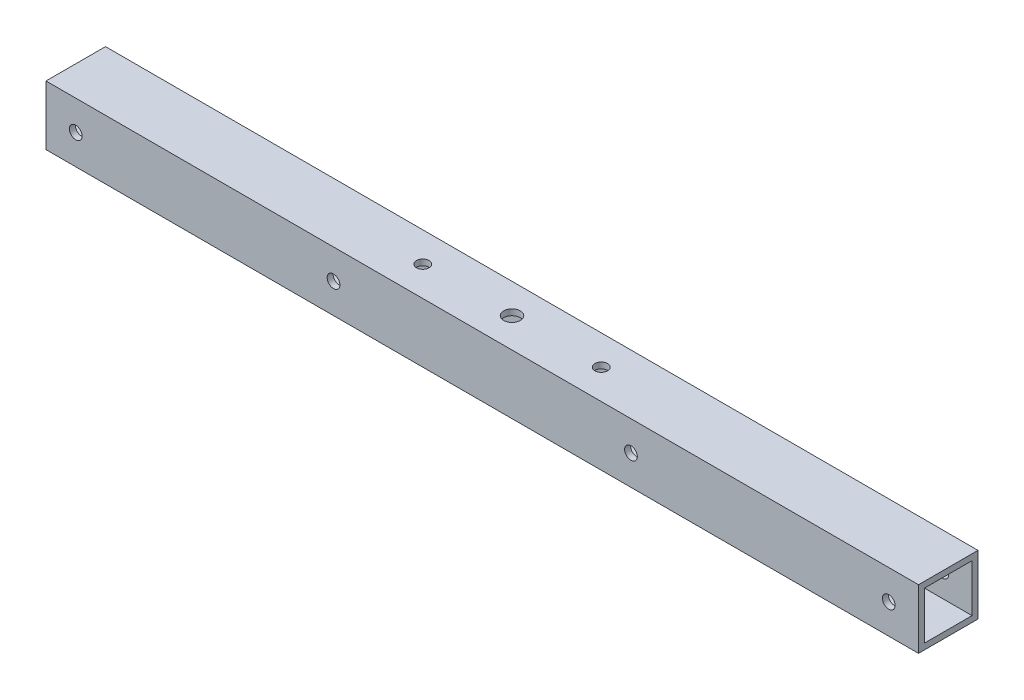
ISO-10303-21;
HEADER;
FILE_DESCRIPTION(('STEP AP214'),'2;1');
FILE_NAME('part.step','',(''),(''),'','','');
FILE_SCHEMA(('AUTOMOTIVE_DESIGN { 1 0 10303 214 1 1 1 1 }'));
ENDSEC;
DATA;
#1=APPLICATION_CONTEXT('core data for automotive mechanical design processes');
#2=APPLICATION_PROTOCOL_DEFINITION('international standard','automotive_design',2000,#1);
#3=PRODUCT_CONTEXT('',#1,'mechanical');
#4=PRODUCT('Part','Part','',(#3));
#5=PRODUCT_RELATED_PRODUCT_CATEGORY('part','',(#4));
#6=PRODUCT_DEFINITION_FORMATION('','',#4);
#7=PRODUCT_DEFINITION_CONTEXT('part definition',#1,'design');
#8=PRODUCT_DEFINITION('design','',#6,#7);
#9=PRODUCT_DEFINITION_SHAPE('','',#8);
#10=(LENGTH_UNIT() NAMED_UNIT(*) SI_UNIT(.MILLI.,.METRE.));
#11=(NAMED_UNIT(*) PLANE_ANGLE_UNIT() SI_UNIT($,.RADIAN.));
#12=(NAMED_UNIT(*) SI_UNIT($,.STERADIAN.) SOLID_ANGLE_UNIT());
#13=UNCERTAINTY_MEASURE_WITH_UNIT(LENGTH_MEASURE(1.E-05),#10,'distance_accuracy_value','');
#14=(GEOMETRIC_REPRESENTATION_CONTEXT(3) GLOBAL_UNCERTAINTY_ASSIGNED_CONTEXT((#13)) GLOBAL_UNIT_ASSIGNED_CONTEXT((#10,
#11,#12)) REPRESENTATION_CONTEXT('',''));
#15=CARTESIAN_POINT('',(0.,0.,0.));
#16=DIRECTION('',(0.,0.,1.));
#17=DIRECTION('',(1.,0.,0.));
#18=AXIS2_PLACEMENT_3D('',#15,#16,#17);
#19=CARTESIAN_POINT('',(220.,0.,0.));
#20=DIRECTION('',(1.,0.,0.));
#21=DIRECTION('',(0.,0.,-1.));
#22=AXIS2_PLACEMENT_3D('',#19,#20,#21);
#23=PLANE('',#22);
#24=DIRECTION('',(0.,1.,0.));
#25=VECTOR('',#24,1.);
#26=CARTESIAN_POINT('',(220.,7.5,-7.5));
#27=LINE('',#26,#25);
#28=CARTESIAN_POINT('',(220.,-7.5,-7.5));
#29=VERTEX_POINT('',#28);
#30=CARTESIAN_POINT('',(220.,7.5,-7.5));
#31=VERTEX_POINT('',#30);
#32=EDGE_CURVE('E153',#29,#31,#27,.T.);
#33=ORIENTED_EDGE('',*,*,#32,.T.);
#34=DIRECTION('',(0.,0.,1.));
#35=VECTOR('',#34,1.);
#36=CARTESIAN_POINT('',(220.,7.5,7.5));
#37=LINE('',#36,#35);
#38=CARTESIAN_POINT('',(220.,7.5,7.5));
#39=VERTEX_POINT('',#38);
#40=EDGE_CURVE('E156',#31,#39,#37,.T.);
#41=ORIENTED_EDGE('',*,*,#40,.T.);
#42=DIRECTION('',(0.,-1.,0.));
#43=VECTOR('',#42,1.);
#44=CARTESIAN_POINT('',(220.,7.5,7.5));
#45=LINE('',#44,#43);
#46=CARTESIAN_POINT('',(220.,-7.5,7.5));
#47=VERTEX_POINT('',#46);
#48=EDGE_CURVE('E159',#39,#47,#45,.T.);
#49=ORIENTED_EDGE('',*,*,#48,.T.);
#50=DIRECTION('',(0.,0.,-1.));
#51=VECTOR('',#50,1.);
#52=CARTESIAN_POINT('',(220.,-7.5,7.5));
#53=LINE('',#52,#51);
#54=EDGE_CURVE('E161',#47,#29,#53,.T.);
#55=ORIENTED_EDGE('',*,*,#54,.T.);
#56=EDGE_LOOP('',(#33,#41,#49,#55));
#57=FACE_BOUND('',#56,.T.);
#58=DIRECTION('',(0.,-1.,0.));
#59=VECTOR('',#58,1.);
#60=CARTESIAN_POINT('',(220.,6.,6.));
#61=LINE('',#60,#59);
#62=CARTESIAN_POINT('',(220.,6.,6.));
#63=VERTEX_POINT('',#62);
#64=CARTESIAN_POINT('',(220.,-6.,6.));
#65=VERTEX_POINT('',#64);
#66=EDGE_CURVE('E123',#63,#65,#61,.T.);
#67=ORIENTED_EDGE('',*,*,#66,.F.);
#68=DIRECTION('',(0.,0.,1.));
#69=VECTOR('',#68,1.);
#70=CARTESIAN_POINT('',(220.,6.,6.));
#71=LINE('',#70,#69);
#72=CARTESIAN_POINT('',(220.,6.,-6.));
#73=VERTEX_POINT('',#72);
#74=EDGE_CURVE('E115',#73,#63,#71,.T.);
#75=ORIENTED_EDGE('',*,*,#74,.F.);
#76=DIRECTION('',(0.,1.,0.));
#77=VECTOR('',#76,1.);
#78=CARTESIAN_POINT('',(220.,6.,-6.));
#79=LINE('',#78,#77);
#80=CARTESIAN_POINT('',(220.,-6.,-6.));
#81=VERTEX_POINT('',#80);
#82=EDGE_CURVE('E137',#81,#73,#79,.T.);
#83=ORIENTED_EDGE('',*,*,#82,.F.);
#84=DIRECTION('',(0.,0.,-1.));
#85=VECTOR('',#84,1.);
#86=CARTESIAN_POINT('',(220.,-6.,6.));
#87=LINE('',#86,#85);
#88=EDGE_CURVE('E135',#65,#81,#87,.T.);
#89=ORIENTED_EDGE('',*,*,#88,.F.);
#90=EDGE_LOOP('',(#67,#75,#83,#89));
#91=FACE_BOUND('',#90,.T.);
#92=ADVANCED_FACE('F48',(#57,#91),#23,.T.);
#93=CARTESIAN_POINT('',(0.,0.,0.));
#94=DIRECTION('',(1.,0.,0.));
#95=DIRECTION('',(0.,0.,-1.));
#96=AXIS2_PLACEMENT_3D('',#93,#94,#95);
#97=PLANE('',#96);
#98=DIRECTION('',(0.,1.,0.));
#99=VECTOR('',#98,1.);
#100=CARTESIAN_POINT('',(0.,7.5,-7.5));
#101=LINE('',#100,#99);
#102=CARTESIAN_POINT('',(0.,-7.5,-7.5));
#103=VERTEX_POINT('',#102);
#104=CARTESIAN_POINT('',(0.,7.5,-7.5));
#105=VERTEX_POINT('',#104);
#106=EDGE_CURVE('E131',#103,#105,#101,.T.);
#107=ORIENTED_EDGE('',*,*,#106,.F.);
#108=DIRECTION('',(0.,0.,-1.));
#109=VECTOR('',#108,1.);
#110=CARTESIAN_POINT('',(0.,-7.5,7.5));
#111=LINE('',#110,#109);
#112=CARTESIAN_POINT('',(0.,-7.5,7.5));
#113=VERTEX_POINT('',#112);
#114=EDGE_CURVE('E157',#113,#103,#111,.T.);
#115=ORIENTED_EDGE('',*,*,#114,.F.);
#116=DIRECTION('',(0.,-1.,0.));
#117=VECTOR('',#116,1.);
#118=CARTESIAN_POINT('',(0.,7.5,7.5));
#119=LINE('',#118,#117);
#120=CARTESIAN_POINT('',(0.,7.5,7.5));
#121=VERTEX_POINT('',#120);
#122=EDGE_CURVE('E168',#121,#113,#119,.T.);
#123=ORIENTED_EDGE('',*,*,#122,.F.);
#124=DIRECTION('',(0.,0.,1.));
#125=VECTOR('',#124,1.);
#126=CARTESIAN_POINT('',(0.,7.5,7.5));
#127=LINE('',#126,#125);
#128=EDGE_CURVE('E166',#105,#121,#127,.T.);
#129=ORIENTED_EDGE('',*,*,#128,.F.);
#130=EDGE_LOOP('',(#107,#115,#123,#129));
#131=FACE_BOUND('',#130,.T.);
#132=DIRECTION('',(0.,0.,1.));
#133=VECTOR('',#132,1.);
#134=CARTESIAN_POINT('',(0.,6.,6.));
#135=LINE('',#134,#133);
#136=CARTESIAN_POINT('',(0.,6.,-6.));
#137=VERTEX_POINT('',#136);
#138=CARTESIAN_POINT('',(0.,6.,6.));
#139=VERTEX_POINT('',#138);
#140=EDGE_CURVE('E73',#137,#139,#135,.T.);
#141=ORIENTED_EDGE('',*,*,#140,.T.);
#142=DIRECTION('',(0.,-1.,0.));
#143=VECTOR('',#142,1.);
#144=CARTESIAN_POINT('',(0.,6.,6.));
#145=LINE('',#144,#143);
#146=CARTESIAN_POINT('',(0.,-6.,6.));
#147=VERTEX_POINT('',#146);
#148=EDGE_CURVE('E130',#139,#147,#145,.T.);
#149=ORIENTED_EDGE('',*,*,#148,.T.);
#150=DIRECTION('',(0.,0.,-1.));
#151=VECTOR('',#150,1.);
#152=CARTESIAN_POINT('',(0.,-6.,6.));
#153=LINE('',#152,#151);
#154=CARTESIAN_POINT('',(0.,-6.,-6.));
#155=VERTEX_POINT('',#154);
#156=EDGE_CURVE('E145',#147,#155,#153,.T.);
#157=ORIENTED_EDGE('',*,*,#156,.T.);
#158=DIRECTION('',(0.,1.,0.));
#159=VECTOR('',#158,1.);
#160=CARTESIAN_POINT('',(0.,6.,-6.));
#161=LINE('',#160,#159);
#162=EDGE_CURVE('E124',#155,#137,#161,.T.);
#163=ORIENTED_EDGE('',*,*,#162,.T.);
#164=EDGE_LOOP('',(#141,#149,#157,#163));
#165=FACE_BOUND('',#164,.T.);
#166=ADVANCED_FACE('F286',(#131,#165),#97,.F.);
#167=CARTESIAN_POINT('',(220.,7.5,-7.5));
#168=DIRECTION('',(0.,0.,1.));
#169=DIRECTION('',(1.,0.,0.));
#170=AXIS2_PLACEMENT_3D('',#167,#168,#169);
#171=PLANE('',#170);
#172=CARTESIAN_POINT('',(7.5,0.,-7.5));
#173=DIRECTION('',(0.,0.,1.));
#174=DIRECTION('',(1.,0.,0.));
#175=AXIS2_PLACEMENT_3D('',#172,#173,#174);
#176=CIRCLE('',#175,1.6);
#177=CARTESIAN_POINT('',(9.1,0.,-7.5));
#178=VERTEX_POINT('',#177);
#179=EDGE_CURVE('E182',#178,#178,#176,.T.);
#180=ORIENTED_EDGE('',*,*,#179,.T.);
#181=EDGE_LOOP('',(#180));
#182=FACE_BOUND('',#181,.T.);
#183=CARTESIAN_POINT('',(147.5,0.,-7.5));
#184=DIRECTION('',(0.,0.,1.));
#185=DIRECTION('',(1.,0.,0.));
#186=AXIS2_PLACEMENT_3D('',#183,#184,#185);
#187=CIRCLE('',#186,1.59999999999999);
#188=CARTESIAN_POINT('',(149.1,0.,-7.5));
#189=VERTEX_POINT('',#188);
#190=EDGE_CURVE('E223',#189,#189,#187,.T.);
#191=ORIENTED_EDGE('',*,*,#190,.T.);
#192=EDGE_LOOP('',(#191));
#193=FACE_BOUND('',#192,.T.);
#194=CARTESIAN_POINT('',(72.5,0.,-7.5));
#195=DIRECTION('',(0.,0.,1.));
#196=DIRECTION('',(1.,0.,0.));
#197=AXIS2_PLACEMENT_3D('',#194,#195,#196);
#198=CIRCLE('',#197,1.60000000000001);
#199=CARTESIAN_POINT('',(74.1,0.,-7.5));
#200=VERTEX_POINT('',#199);
#201=EDGE_CURVE('E234',#200,#200,#198,.T.);
#202=ORIENTED_EDGE('',*,*,#201,.T.);
#203=EDGE_LOOP('',(#202));
#204=FACE_BOUND('',#203,.T.);
#205=CARTESIAN_POINT('',(212.5,0.,-7.5));
#206=DIRECTION('',(0.,0.,1.));
#207=DIRECTION('',(1.,0.,0.));
#208=AXIS2_PLACEMENT_3D('',#205,#206,#207);
#209=CIRCLE('',#208,1.59999999999999);
#210=CARTESIAN_POINT('',(214.1,0.,-7.5));
#211=VERTEX_POINT('',#210);
#212=EDGE_CURVE('E222',#211,#211,#209,.T.);
#213=ORIENTED_EDGE('',*,*,#212,.T.);
#214=EDGE_LOOP('',(#213));
#215=FACE_BOUND('',#214,.T.);
#216=ORIENTED_EDGE('',*,*,#106,.T.);
#217=DIRECTION('',(-1.,0.,0.));
#218=VECTOR('',#217,1.);
#219=CARTESIAN_POINT('',(220.,7.5,-7.5));
#220=LINE('',#219,#218);
#221=EDGE_CURVE('E13',#31,#105,#220,.T.);
#222=ORIENTED_EDGE('',*,*,#221,.F.);
#223=ORIENTED_EDGE('',*,*,#32,.F.);
#224=DIRECTION('',(-1.,0.,0.));
#225=VECTOR('',#224,1.);
#226=CARTESIAN_POINT('',(220.,-7.5,-7.5));
#227=LINE('',#226,#225);
#228=EDGE_CURVE('E163',#29,#103,#227,.T.);
#229=ORIENTED_EDGE('',*,*,#228,.T.);
#230=EDGE_LOOP('',(#216,#222,#223,#229));
#231=FACE_BOUND('',#230,.T.);
#232=ADVANCED_FACE('F50',(#182,#193,#204,#215,#231),#171,.F.);
#233=CARTESIAN_POINT('',(220.,7.5,7.5));
#234=DIRECTION('',(0.,-1.,0.));
#235=DIRECTION('',(0.,0.,-1.));
#236=AXIS2_PLACEMENT_3D('',#233,#234,#235);
#237=PLANE('',#236);
#238=CARTESIAN_POINT('',(87.5,7.5,0.));
#239=DIRECTION('',(0.,1.,0.));
#240=DIRECTION('',(0.,0.,1.));
#241=AXIS2_PLACEMENT_3D('',#238,#239,#240);
#242=CIRCLE('',#241,1.60000000000001);
#243=CARTESIAN_POINT('',(87.5,7.5,1.60000000000001));
#244=VERTEX_POINT('',#243);
#245=EDGE_CURVE('E328',#244,#244,#242,.T.);
#246=ORIENTED_EDGE('',*,*,#245,.F.);
#247=EDGE_LOOP('',(#246));
#248=FACE_BOUND('',#247,.T.);
#249=CARTESIAN_POINT('',(132.5,7.5,0.));
#250=DIRECTION('',(0.,1.,0.));
#251=DIRECTION('',(0.,0.,1.));
#252=AXIS2_PLACEMENT_3D('',#249,#250,#251);
#253=CIRCLE('',#252,1.59999999999999);
#254=CARTESIAN_POINT('',(132.5,7.5,1.59999999999999));
#255=VERTEX_POINT('',#254);
#256=EDGE_CURVE('E332',#255,#255,#253,.T.);
#257=ORIENTED_EDGE('',*,*,#256,.F.);
#258=EDGE_LOOP('',(#257));
#259=FACE_BOUND('',#258,.T.);
#260=CARTESIAN_POINT('',(110.,7.5,0.));
#261=DIRECTION('',(0.,1.,0.));
#262=DIRECTION('',(0.,0.,1.));
#263=AXIS2_PLACEMENT_3D('',#260,#261,#262);
#264=CIRCLE('',#263,2.1);
#265=CARTESIAN_POINT('',(110.,7.5,2.1));
#266=VERTEX_POINT('',#265);
#267=EDGE_CURVE('E210',#266,#266,#264,.T.);
#268=ORIENTED_EDGE('',*,*,#267,.F.);
#269=EDGE_LOOP('',(#268));
#270=FACE_BOUND('',#269,.T.);
#271=ORIENTED_EDGE('',*,*,#128,.T.);
#272=DIRECTION('',(-1.,0.,0.));
#273=VECTOR('',#272,1.);
#274=CARTESIAN_POINT('',(220.,7.5,7.5));
#275=LINE('',#274,#273);
#276=EDGE_CURVE('E57',#39,#121,#275,.T.);
#277=ORIENTED_EDGE('',*,*,#276,.F.);
#278=ORIENTED_EDGE('',*,*,#40,.F.);
#279=ORIENTED_EDGE('',*,*,#221,.T.);
#280=EDGE_LOOP('',(#271,#277,#278,#279));
#281=FACE_BOUND('',#280,.T.);
#282=ADVANCED_FACE('F273',(#248,#259,#270,#281),#237,.F.);
#283=CARTESIAN_POINT('',(220.,7.5,7.5));
#284=DIRECTION('',(0.,0.,-1.));
#285=DIRECTION('',(-1.,0.,0.));
#286=AXIS2_PLACEMENT_3D('',#283,#284,#285);
#287=PLANE('',#286);
#288=CARTESIAN_POINT('',(7.5,0.,7.5));
#289=DIRECTION('',(0.,0.,1.));
#290=DIRECTION('',(1.,0.,0.));
#291=AXIS2_PLACEMENT_3D('',#288,#289,#290);
#292=CIRCLE('',#291,1.6);
#293=CARTESIAN_POINT('',(9.1,0.,7.5));
#294=VERTEX_POINT('',#293);
#295=EDGE_CURVE('E219',#294,#294,#292,.T.);
#296=ORIENTED_EDGE('',*,*,#295,.F.);
#297=EDGE_LOOP('',(#296));
#298=FACE_BOUND('',#297,.T.);
#299=CARTESIAN_POINT('',(147.5,0.,7.5));
#300=DIRECTION('',(0.,0.,1.));
#301=DIRECTION('',(1.,0.,0.));
#302=AXIS2_PLACEMENT_3D('',#299,#300,#301);
#303=CIRCLE('',#302,1.59999999999999);
#304=CARTESIAN_POINT('',(149.1,0.,7.5));
#305=VERTEX_POINT('',#304);
#306=EDGE_CURVE('E216',#305,#305,#303,.T.);
#307=ORIENTED_EDGE('',*,*,#306,.F.);
#308=EDGE_LOOP('',(#307));
#309=FACE_BOUND('',#308,.T.);
#310=CARTESIAN_POINT('',(72.5,0.,7.5));
#311=DIRECTION('',(0.,0.,1.));
#312=DIRECTION('',(1.,0.,0.));
#313=AXIS2_PLACEMENT_3D('',#310,#311,#312);
#314=CIRCLE('',#313,1.60000000000001);
#315=CARTESIAN_POINT('',(74.1,0.,7.5));
#316=VERTEX_POINT('',#315);
#317=EDGE_CURVE('E226',#316,#316,#314,.T.);
#318=ORIENTED_EDGE('',*,*,#317,.F.);
#319=EDGE_LOOP('',(#318));
#320=FACE_BOUND('',#319,.T.);
#321=CARTESIAN_POINT('',(212.5,0.,7.5));
#322=DIRECTION('',(0.,0.,1.));
#323=DIRECTION('',(1.,0.,0.));
#324=AXIS2_PLACEMENT_3D('',#321,#322,#323);
#325=CIRCLE('',#324,1.59999999999999);
#326=CARTESIAN_POINT('',(214.1,0.,7.5));
#327=VERTEX_POINT('',#326);
#328=EDGE_CURVE('E231',#327,#327,#325,.T.);
#329=ORIENTED_EDGE('',*,*,#328,.F.);
#330=EDGE_LOOP('',(#329));
#331=FACE_BOUND('',#330,.T.);
#332=ORIENTED_EDGE('',*,*,#122,.T.);
#333=DIRECTION('',(-1.,0.,0.));
#334=VECTOR('',#333,1.);
#335=CARTESIAN_POINT('',(220.,-7.5,7.5));
#336=LINE('',#335,#334);
#337=EDGE_CURVE('E173',#47,#113,#336,.T.);
#338=ORIENTED_EDGE('',*,*,#337,.F.);
#339=ORIENTED_EDGE('',*,*,#48,.F.);
#340=ORIENTED_EDGE('',*,*,#276,.T.);
#341=EDGE_LOOP('',(#332,#338,#339,#340));
#342=FACE_BOUND('',#341,.T.);
#343=ADVANCED_FACE('F269',(#298,#309,#320,#331,#342),#287,.F.);
#344=CARTESIAN_POINT('',(220.,-7.5,7.5));
#345=DIRECTION('',(0.,1.,0.));
#346=DIRECTION('',(0.,0.,1.));
#347=AXIS2_PLACEMENT_3D('',#344,#345,#346);
#348=PLANE('',#347);
#349=CARTESIAN_POINT('',(87.5,-7.5,0.));
#350=DIRECTION('',(0.,1.,0.));
#351=DIRECTION('',(0.,0.,1.));
#352=AXIS2_PLACEMENT_3D('',#349,#350,#351);
#353=CIRCLE('',#352,1.60000000000001);
#354=CARTESIAN_POINT('',(87.5,-7.5,1.60000000000001));
#355=VERTEX_POINT('',#354);
#356=EDGE_CURVE('E318',#355,#355,#353,.T.);
#357=ORIENTED_EDGE('',*,*,#356,.T.);
#358=EDGE_LOOP('',(#357));
#359=FACE_BOUND('',#358,.T.);
#360=CARTESIAN_POINT('',(132.5,-7.5,0.));
#361=DIRECTION('',(0.,1.,0.));
#362=DIRECTION('',(0.,0.,1.));
#363=AXIS2_PLACEMENT_3D('',#360,#361,#362);
#364=CIRCLE('',#363,1.59999999999999);
#365=CARTESIAN_POINT('',(132.5,-7.5,1.59999999999999));
#366=VERTEX_POINT('',#365);
#367=EDGE_CURVE('E322',#366,#366,#364,.T.);
#368=ORIENTED_EDGE('',*,*,#367,.T.);
#369=EDGE_LOOP('',(#368));
#370=FACE_BOUND('',#369,.T.);
#371=CARTESIAN_POINT('',(110.,-7.5,0.));
#372=DIRECTION('',(0.,1.,0.));
#373=DIRECTION('',(0.,0.,1.));
#374=AXIS2_PLACEMENT_3D('',#371,#372,#373);
#375=CIRCLE('',#374,2.1);
#376=CARTESIAN_POINT('',(110.,-7.5,2.1));
#377=VERTEX_POINT('',#376);
#378=EDGE_CURVE('E197',#377,#377,#375,.T.);
#379=ORIENTED_EDGE('',*,*,#378,.T.);
#380=EDGE_LOOP('',(#379));
#381=FACE_BOUND('',#380,.T.);
#382=ORIENTED_EDGE('',*,*,#114,.T.);
#383=ORIENTED_EDGE('',*,*,#228,.F.);
#384=ORIENTED_EDGE('',*,*,#54,.F.);
#385=ORIENTED_EDGE('',*,*,#337,.T.);
#386=EDGE_LOOP('',(#382,#383,#384,#385));
#387=FACE_BOUND('',#386,.T.);
#388=ADVANCED_FACE('F272',(#359,#370,#381,#387),#348,.F.);
#389=CARTESIAN_POINT('',(220.,6.,6.));
#390=DIRECTION('',(0.,-1.,0.));
#391=DIRECTION('',(0.,0.,-1.));
#392=AXIS2_PLACEMENT_3D('',#389,#390,#391);
#393=PLANE('',#392);
#394=CARTESIAN_POINT('',(87.5,6.,0.));
#395=DIRECTION('',(0.,-1.,0.));
#396=DIRECTION('',(0.,0.,-1.));
#397=AXIS2_PLACEMENT_3D('',#394,#395,#396);
#398=CIRCLE('',#397,1.60000000000001);
#399=CARTESIAN_POINT('',(87.5,6.,-1.60000000000001));
#400=VERTEX_POINT('',#399);
#401=EDGE_CURVE('E213',#400,#400,#398,.T.);
#402=ORIENTED_EDGE('',*,*,#401,.F.);
#403=EDGE_LOOP('',(#402));
#404=FACE_BOUND('',#403,.T.);
#405=CARTESIAN_POINT('',(132.5,6.,0.));
#406=DIRECTION('',(0.,-1.,0.));
#407=DIRECTION('',(0.,0.,-1.));
#408=AXIS2_PLACEMENT_3D('',#405,#406,#407);
#409=CIRCLE('',#408,1.59999999999999);
#410=CARTESIAN_POINT('',(132.5,6.,-1.59999999999999));
#411=VERTEX_POINT('',#410);
#412=EDGE_CURVE('E200',#411,#411,#409,.T.);
#413=ORIENTED_EDGE('',*,*,#412,.F.);
#414=EDGE_LOOP('',(#413));
#415=FACE_BOUND('',#414,.T.);
#416=CARTESIAN_POINT('',(110.,6.,0.));
#417=DIRECTION('',(0.,-1.,0.));
#418=DIRECTION('',(0.,0.,-1.));
#419=AXIS2_PLACEMENT_3D('',#416,#417,#418);
#420=CIRCLE('',#419,2.1);
#421=CARTESIAN_POINT('',(110.,6.,-2.1));
#422=VERTEX_POINT('',#421);
#423=EDGE_CURVE('E196',#422,#422,#420,.T.);
#424=ORIENTED_EDGE('',*,*,#423,.F.);
#425=EDGE_LOOP('',(#424));
#426=FACE_BOUND('',#425,.T.);
#427=ORIENTED_EDGE('',*,*,#140,.F.);
#428=DIRECTION('',(-1.,0.,0.));
#429=VECTOR('',#428,1.);
#430=CARTESIAN_POINT('',(220.,6.,-6.));
#431=LINE('',#430,#429);
#432=EDGE_CURVE('E119',#73,#137,#431,.T.);
#433=ORIENTED_EDGE('',*,*,#432,.F.);
#434=ORIENTED_EDGE('',*,*,#74,.T.);
#435=DIRECTION('',(-1.,0.,0.));
#436=VECTOR('',#435,1.);
#437=CARTESIAN_POINT('',(220.,6.,6.));
#438=LINE('',#437,#436);
#439=EDGE_CURVE('E118',#63,#139,#438,.T.);
#440=ORIENTED_EDGE('',*,*,#439,.T.);
#441=EDGE_LOOP('',(#427,#433,#434,#440));
#442=FACE_BOUND('',#441,.T.);
#443=ADVANCED_FACE('F117',(#404,#415,#426,#442),#393,.T.);
#444=CARTESIAN_POINT('',(220.,6.,6.));
#445=DIRECTION('',(0.,0.,-1.));
#446=DIRECTION('',(0.,1.,0.));
#447=AXIS2_PLACEMENT_3D('',#444,#445,#446);
#448=PLANE('',#447);
#449=CARTESIAN_POINT('',(7.5,0.,6.));
#450=DIRECTION('',(0.,0.,-1.));
#451=DIRECTION('',(0.,1.,0.));
#452=AXIS2_PLACEMENT_3D('',#449,#450,#451);
#453=CIRCLE('',#452,1.6);
#454=CARTESIAN_POINT('',(7.5,1.6,6.));
#455=VERTEX_POINT('',#454);
#456=EDGE_CURVE('E143',#455,#455,#453,.T.);
#457=ORIENTED_EDGE('',*,*,#456,.F.);
#458=EDGE_LOOP('',(#457));
#459=FACE_BOUND('',#458,.T.);
#460=CARTESIAN_POINT('',(147.5,0.,6.));
#461=DIRECTION('',(0.,0.,-1.));
#462=DIRECTION('',(0.,1.,0.));
#463=AXIS2_PLACEMENT_3D('',#460,#461,#462);
#464=CIRCLE('',#463,1.59999999999999);
#465=CARTESIAN_POINT('',(147.5,1.59999999999999,6.));
#466=VERTEX_POINT('',#465);
#467=EDGE_CURVE('E190',#466,#466,#464,.T.);
#468=ORIENTED_EDGE('',*,*,#467,.F.);
#469=EDGE_LOOP('',(#468));
#470=FACE_BOUND('',#469,.T.);
#471=CARTESIAN_POINT('',(72.5,0.,6.));
#472=DIRECTION('',(0.,0.,-1.));
#473=DIRECTION('',(0.,1.,0.));
#474=AXIS2_PLACEMENT_3D('',#471,#472,#473);
#475=CIRCLE('',#474,1.60000000000001);
#476=CARTESIAN_POINT('',(72.5,1.60000000000001,6.));
#477=VERTEX_POINT('',#476);
#478=EDGE_CURVE('E186',#477,#477,#475,.T.);
#479=ORIENTED_EDGE('',*,*,#478,.F.);
#480=EDGE_LOOP('',(#479));
#481=FACE_BOUND('',#480,.T.);
#482=CARTESIAN_POINT('',(212.5,0.,6.));
#483=DIRECTION('',(0.,0.,-1.));
#484=DIRECTION('',(0.,1.,0.));
#485=AXIS2_PLACEMENT_3D('',#482,#483,#484);
#486=CIRCLE('',#485,1.59999999999999);
#487=CARTESIAN_POINT('',(212.5,1.59999999999999,6.));
#488=VERTEX_POINT('',#487);
#489=EDGE_CURVE('E181',#488,#488,#486,.T.);
#490=ORIENTED_EDGE('',*,*,#489,.F.);
#491=EDGE_LOOP('',(#490));
#492=FACE_BOUND('',#491,.T.);
#493=ORIENTED_EDGE('',*,*,#148,.F.);
#494=ORIENTED_EDGE('',*,*,#439,.F.);
#495=ORIENTED_EDGE('',*,*,#66,.T.);
#496=DIRECTION('',(-1.,0.,0.));
#497=VECTOR('',#496,1.);
#498=CARTESIAN_POINT('',(220.,-6.,6.));
#499=LINE('',#498,#497);
#500=EDGE_CURVE('E132',#65,#147,#499,.T.);
#501=ORIENTED_EDGE('',*,*,#500,.T.);
#502=EDGE_LOOP('',(#493,#494,#495,#501));
#503=FACE_BOUND('',#502,.T.);
#504=ADVANCED_FACE('F127',(#459,#470,#481,#492,#503),#448,.T.);
#505=CARTESIAN_POINT('',(220.,-6.,6.));
#506=DIRECTION('',(0.,1.,0.));
#507=DIRECTION('',(0.,0.,1.));
#508=AXIS2_PLACEMENT_3D('',#505,#506,#507);
#509=PLANE('',#508);
#510=CARTESIAN_POINT('',(87.5,-6.,0.));
#511=DIRECTION('',(0.,1.,0.));
#512=DIRECTION('',(0.,0.,1.));
#513=AXIS2_PLACEMENT_3D('',#510,#511,#512);
#514=CIRCLE('',#513,1.60000000000001);
#515=CARTESIAN_POINT('',(87.5,-6.,1.60000000000001));
#516=VERTEX_POINT('',#515);
#517=EDGE_CURVE('E52',#516,#516,#514,.T.);
#518=ORIENTED_EDGE('',*,*,#517,.F.);
#519=EDGE_LOOP('',(#518));
#520=FACE_BOUND('',#519,.T.);
#521=CARTESIAN_POINT('',(132.5,-6.,0.));
#522=DIRECTION('',(0.,1.,0.));
#523=DIRECTION('',(0.,0.,1.));
#524=AXIS2_PLACEMENT_3D('',#521,#522,#523);
#525=CIRCLE('',#524,1.59999999999999);
#526=CARTESIAN_POINT('',(132.5,-6.,1.59999999999999));
#527=VERTEX_POINT('',#526);
#528=EDGE_CURVE('E198',#527,#527,#525,.T.);
#529=ORIENTED_EDGE('',*,*,#528,.F.);
#530=EDGE_LOOP('',(#529));
#531=FACE_BOUND('',#530,.T.);
#532=CARTESIAN_POINT('',(110.,-6.,0.));
#533=DIRECTION('',(0.,1.,0.));
#534=DIRECTION('',(0.,0.,1.));
#535=AXIS2_PLACEMENT_3D('',#532,#533,#534);
#536=CIRCLE('',#535,2.1);
#537=CARTESIAN_POINT('',(110.,-6.,2.1));
#538=VERTEX_POINT('',#537);
#539=EDGE_CURVE('E194',#538,#538,#536,.T.);
#540=ORIENTED_EDGE('',*,*,#539,.F.);
#541=EDGE_LOOP('',(#540));
#542=FACE_BOUND('',#541,.T.);
#543=ORIENTED_EDGE('',*,*,#156,.F.);
#544=ORIENTED_EDGE('',*,*,#500,.F.);
#545=ORIENTED_EDGE('',*,*,#88,.T.);
#546=DIRECTION('',(-1.,0.,0.));
#547=VECTOR('',#546,1.);
#548=CARTESIAN_POINT('',(220.,-6.,-6.));
#549=LINE('',#548,#547);
#550=EDGE_CURVE('E65',#81,#155,#549,.T.);
#551=ORIENTED_EDGE('',*,*,#550,.T.);
#552=EDGE_LOOP('',(#543,#544,#545,#551));
#553=FACE_BOUND('',#552,.T.);
#554=ADVANCED_FACE('F252',(#520,#531,#542,#553),#509,.T.);
#555=CARTESIAN_POINT('',(220.,6.,-6.));
#556=DIRECTION('',(0.,0.,1.));
#557=DIRECTION('',(1.,0.,0.));
#558=AXIS2_PLACEMENT_3D('',#555,#556,#557);
#559=PLANE('',#558);
#560=CARTESIAN_POINT('',(7.5,0.,-6.));
#561=DIRECTION('',(0.,0.,1.));
#562=DIRECTION('',(1.,0.,0.));
#563=AXIS2_PLACEMENT_3D('',#560,#561,#562);
#564=CIRCLE('',#563,1.6);
#565=CARTESIAN_POINT('',(9.1,0.,-6.));
#566=VERTEX_POINT('',#565);
#567=EDGE_CURVE('E191',#566,#566,#564,.T.);
#568=ORIENTED_EDGE('',*,*,#567,.F.);
#569=EDGE_LOOP('',(#568));
#570=FACE_BOUND('',#569,.T.);
#571=CARTESIAN_POINT('',(147.5,0.,-6.));
#572=DIRECTION('',(0.,0.,1.));
#573=DIRECTION('',(1.,0.,0.));
#574=AXIS2_PLACEMENT_3D('',#571,#572,#573);
#575=CIRCLE('',#574,1.59999999999999);
#576=CARTESIAN_POINT('',(149.1,0.,-6.));
#577=VERTEX_POINT('',#576);
#578=EDGE_CURVE('E187',#577,#577,#575,.T.);
#579=ORIENTED_EDGE('',*,*,#578,.F.);
#580=EDGE_LOOP('',(#579));
#581=FACE_BOUND('',#580,.T.);
#582=CARTESIAN_POINT('',(72.5,0.,-6.));
#583=DIRECTION('',(0.,0.,1.));
#584=DIRECTION('',(1.,0.,0.));
#585=AXIS2_PLACEMENT_3D('',#582,#583,#584);
#586=CIRCLE('',#585,1.60000000000001);
#587=CARTESIAN_POINT('',(74.1,0.,-6.));
#588=VERTEX_POINT('',#587);
#589=EDGE_CURVE('E183',#588,#588,#586,.T.);
#590=ORIENTED_EDGE('',*,*,#589,.F.);
#591=EDGE_LOOP('',(#590));
#592=FACE_BOUND('',#591,.T.);
#593=CARTESIAN_POINT('',(212.5,0.,-6.));
#594=DIRECTION('',(0.,0.,1.));
#595=DIRECTION('',(1.,0.,0.));
#596=AXIS2_PLACEMENT_3D('',#593,#594,#595);
#597=CIRCLE('',#596,1.59999999999999);
#598=CARTESIAN_POINT('',(214.1,0.,-6.));
#599=VERTEX_POINT('',#598);
#600=EDGE_CURVE('E178',#599,#599,#597,.T.);
#601=ORIENTED_EDGE('',*,*,#600,.F.);
#602=EDGE_LOOP('',(#601));
#603=FACE_BOUND('',#602,.T.);
#604=ORIENTED_EDGE('',*,*,#162,.F.);
#605=ORIENTED_EDGE('',*,*,#550,.F.);
#606=ORIENTED_EDGE('',*,*,#82,.T.);
#607=ORIENTED_EDGE('',*,*,#432,.T.);
#608=EDGE_LOOP('',(#604,#605,#606,#607));
#609=FACE_BOUND('',#608,.T.);
#610=ADVANCED_FACE('F368',(#570,#581,#592,#603,#609),#559,.T.);
#611=CARTESIAN_POINT('',(212.5,0.,-7.5));
#612=DIRECTION('',(0.,0.,1.));
#613=DIRECTION('',(1.,0.,0.));
#614=AXIS2_PLACEMENT_3D('',#611,#612,#613);
#615=CYLINDRICAL_SURFACE('',#614,1.59999999999999);
#616=ORIENTED_EDGE('',*,*,#600,.T.);
#617=EDGE_LOOP('',(#616));
#618=FACE_BOUND('',#617,.T.);
#619=ORIENTED_EDGE('',*,*,#212,.F.);
#620=EDGE_LOOP('',(#619));
#621=FACE_BOUND('',#620,.T.);
#622=ADVANCED_FACE('F266',(#618,#621),#615,.F.);
#623=CARTESIAN_POINT('',(72.5,0.,-7.5));
#624=DIRECTION('',(0.,0.,1.));
#625=DIRECTION('',(1.,0.,0.));
#626=AXIS2_PLACEMENT_3D('',#623,#624,#625);
#627=CYLINDRICAL_SURFACE('',#626,1.60000000000001);
#628=ORIENTED_EDGE('',*,*,#589,.T.);
#629=EDGE_LOOP('',(#628));
#630=FACE_BOUND('',#629,.T.);
#631=ORIENTED_EDGE('',*,*,#201,.F.);
#632=EDGE_LOOP('',(#631));
#633=FACE_BOUND('',#632,.T.);
#634=ADVANCED_FACE('F378',(#630,#633),#627,.F.);
#635=CARTESIAN_POINT('',(147.5,0.,-7.5));
#636=DIRECTION('',(0.,0.,1.));
#637=DIRECTION('',(1.,0.,0.));
#638=AXIS2_PLACEMENT_3D('',#635,#636,#637);
#639=CYLINDRICAL_SURFACE('',#638,1.59999999999999);
#640=ORIENTED_EDGE('',*,*,#578,.T.);
#641=EDGE_LOOP('',(#640));
#642=FACE_BOUND('',#641,.T.);
#643=ORIENTED_EDGE('',*,*,#190,.F.);
#644=EDGE_LOOP('',(#643));
#645=FACE_BOUND('',#644,.T.);
#646=ADVANCED_FACE('F384',(#642,#645),#639,.F.);
#647=CARTESIAN_POINT('',(7.5,0.,-7.5));
#648=DIRECTION('',(0.,0.,1.));
#649=DIRECTION('',(1.,0.,0.));
#650=AXIS2_PLACEMENT_3D('',#647,#648,#649);
#651=CYLINDRICAL_SURFACE('',#650,1.6);
#652=ORIENTED_EDGE('',*,*,#567,.T.);
#653=EDGE_LOOP('',(#652));
#654=FACE_BOUND('',#653,.T.);
#655=ORIENTED_EDGE('',*,*,#179,.F.);
#656=EDGE_LOOP('',(#655));
#657=FACE_BOUND('',#656,.T.);
#658=ADVANCED_FACE('F264',(#654,#657),#651,.F.);
#659=ORIENTED_EDGE('',*,*,#489,.T.);
#660=EDGE_LOOP('',(#659));
#661=FACE_BOUND('',#660,.T.);
#662=ORIENTED_EDGE('',*,*,#328,.T.);
#663=EDGE_LOOP('',(#662));
#664=FACE_BOUND('',#663,.T.);
#665=ADVANCED_FACE('F260',(#661,#664),#615,.F.);
#666=ORIENTED_EDGE('',*,*,#478,.T.);
#667=EDGE_LOOP('',(#666));
#668=FACE_BOUND('',#667,.T.);
#669=ORIENTED_EDGE('',*,*,#317,.T.);
#670=EDGE_LOOP('',(#669));
#671=FACE_BOUND('',#670,.T.);
#672=ADVANCED_FACE('F263',(#668,#671),#627,.F.);
#673=ORIENTED_EDGE('',*,*,#467,.T.);
#674=EDGE_LOOP('',(#673));
#675=FACE_BOUND('',#674,.T.);
#676=ORIENTED_EDGE('',*,*,#306,.T.);
#677=EDGE_LOOP('',(#676));
#678=FACE_BOUND('',#677,.T.);
#679=ADVANCED_FACE('F363',(#675,#678),#639,.F.);
#680=ORIENTED_EDGE('',*,*,#456,.T.);
#681=EDGE_LOOP('',(#680));
#682=FACE_BOUND('',#681,.T.);
#683=ORIENTED_EDGE('',*,*,#295,.T.);
#684=EDGE_LOOP('',(#683));
#685=FACE_BOUND('',#684,.T.);
#686=ADVANCED_FACE('F247',(#682,#685),#651,.F.);
#687=CARTESIAN_POINT('',(110.,-7.5,0.));
#688=DIRECTION('',(0.,1.,0.));
#689=DIRECTION('',(0.,0.,1.));
#690=AXIS2_PLACEMENT_3D('',#687,#688,#689);
#691=CYLINDRICAL_SURFACE('',#690,2.1);
#692=ORIENTED_EDGE('',*,*,#539,.T.);
#693=EDGE_LOOP('',(#692));
#694=FACE_BOUND('',#693,.T.);
#695=ORIENTED_EDGE('',*,*,#378,.F.);
#696=EDGE_LOOP('',(#695));
#697=FACE_BOUND('',#696,.T.);
#698=ADVANCED_FACE('F345',(#694,#697),#691,.F.);
#699=CARTESIAN_POINT('',(132.5,-7.5,0.));
#700=DIRECTION('',(0.,1.,0.));
#701=DIRECTION('',(0.,0.,1.));
#702=AXIS2_PLACEMENT_3D('',#699,#700,#701);
#703=CYLINDRICAL_SURFACE('',#702,1.59999999999999);
#704=ORIENTED_EDGE('',*,*,#528,.T.);
#705=EDGE_LOOP('',(#704));
#706=FACE_BOUND('',#705,.T.);
#707=ORIENTED_EDGE('',*,*,#367,.F.);
#708=EDGE_LOOP('',(#707));
#709=FACE_BOUND('',#708,.T.);
#710=ADVANCED_FACE('F353',(#706,#709),#703,.F.);
#711=CARTESIAN_POINT('',(87.5,-7.5,0.));
#712=DIRECTION('',(0.,1.,0.));
#713=DIRECTION('',(0.,0.,1.));
#714=AXIS2_PLACEMENT_3D('',#711,#712,#713);
#715=CYLINDRICAL_SURFACE('',#714,1.60000000000001);
#716=ORIENTED_EDGE('',*,*,#517,.T.);
#717=EDGE_LOOP('',(#716));
#718=FACE_BOUND('',#717,.T.);
#719=ORIENTED_EDGE('',*,*,#356,.F.);
#720=EDGE_LOOP('',(#719));
#721=FACE_BOUND('',#720,.T.);
#722=ADVANCED_FACE('F343',(#718,#721),#715,.F.);
#723=ORIENTED_EDGE('',*,*,#423,.T.);
#724=EDGE_LOOP('',(#723));
#725=FACE_BOUND('',#724,.T.);
#726=ORIENTED_EDGE('',*,*,#267,.T.);
#727=EDGE_LOOP('',(#726));
#728=FACE_BOUND('',#727,.T.);
#729=ADVANCED_FACE('F341',(#725,#728),#691,.F.);
#730=ORIENTED_EDGE('',*,*,#412,.T.);
#731=EDGE_LOOP('',(#730));
#732=FACE_BOUND('',#731,.T.);
#733=ORIENTED_EDGE('',*,*,#256,.T.);
#734=EDGE_LOOP('',(#733));
#735=FACE_BOUND('',#734,.T.);
#736=ADVANCED_FACE('F337',(#732,#735),#703,.F.);
#737=ORIENTED_EDGE('',*,*,#401,.T.);
#738=EDGE_LOOP('',(#737));
#739=FACE_BOUND('',#738,.T.);
#740=ORIENTED_EDGE('',*,*,#245,.T.);
#741=EDGE_LOOP('',(#740));
#742=FACE_BOUND('',#741,.T.);
#743=ADVANCED_FACE('F350',(#739,#742),#715,.F.);
#744=CLOSED_SHELL('',(#92,#166,#232,#282,#343,#388,#443,#504,#554,#610,#622,#634,#646,#658,#665,
#672,#679,#686,#698,#710,#722,#729,#736,#743));
#745=MANIFOLD_SOLID_BREP('B2',#744);
#746=ADVANCED_BREP_SHAPE_REPRESENTATION('',(#18,#745),#14);
#747=SHAPE_DEFINITION_REPRESENTATION(#9,#746);
ENDSEC;
END-ISO-10303-21;
